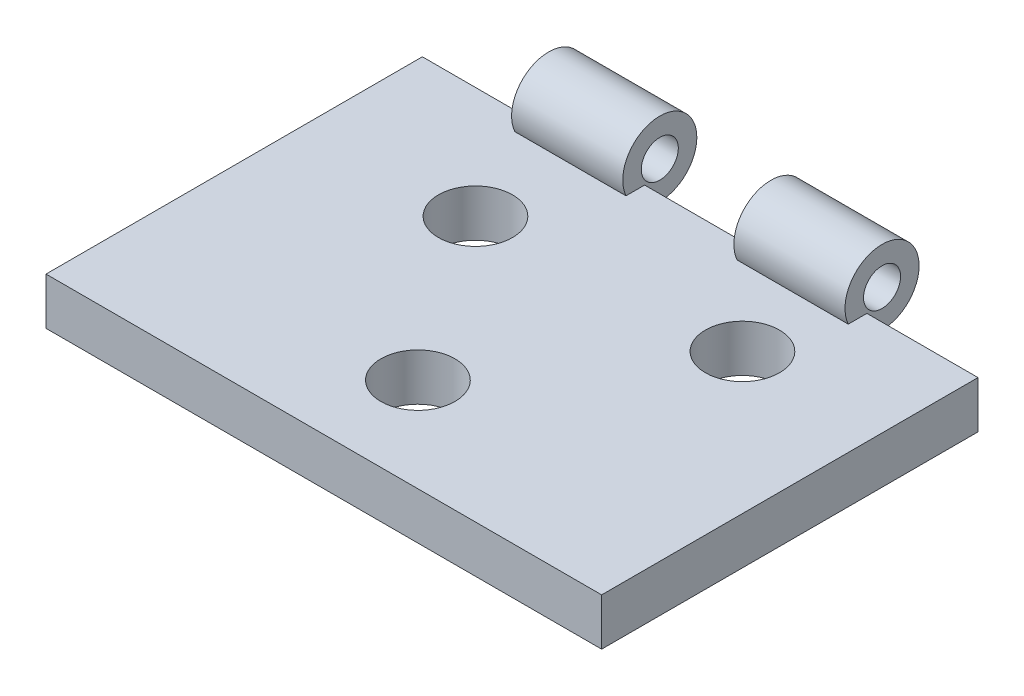
ISO-10303-21;
HEADER;
FILE_DESCRIPTION(('STEP AP214'),'2;1');
FILE_NAME('part.step','',(''),(''),'','','');
FILE_SCHEMA(('AUTOMOTIVE_DESIGN { 1 0 10303 214 1 1 1 1 }'));
ENDSEC;
DATA;
#1=APPLICATION_CONTEXT('core data for automotive mechanical design processes');
#2=APPLICATION_PROTOCOL_DEFINITION('international standard','automotive_design',2000,#1);
#3=PRODUCT_CONTEXT('',#1,'mechanical');
#4=PRODUCT('Part','Part','',(#3));
#5=PRODUCT_RELATED_PRODUCT_CATEGORY('part','',(#4));
#6=PRODUCT_DEFINITION_FORMATION('','',#4);
#7=PRODUCT_DEFINITION_CONTEXT('part definition',#1,'design');
#8=PRODUCT_DEFINITION('design','',#6,#7);
#9=PRODUCT_DEFINITION_SHAPE('','',#8);
#10=(LENGTH_UNIT() NAMED_UNIT(*) SI_UNIT(.MILLI.,.METRE.));
#11=(NAMED_UNIT(*) PLANE_ANGLE_UNIT() SI_UNIT($,.RADIAN.));
#12=(NAMED_UNIT(*) SI_UNIT($,.STERADIAN.) SOLID_ANGLE_UNIT());
#13=UNCERTAINTY_MEASURE_WITH_UNIT(LENGTH_MEASURE(1.E-05),#10,'distance_accuracy_value','');
#14=(GEOMETRIC_REPRESENTATION_CONTEXT(3) GLOBAL_UNCERTAINTY_ASSIGNED_CONTEXT((#13)) GLOBAL_UNIT_ASSIGNED_CONTEXT((#10,
#11,#12)) REPRESENTATION_CONTEXT('',''));
#15=CARTESIAN_POINT('',(0.,0.,0.));
#16=DIRECTION('',(0.,0.,1.));
#17=DIRECTION('',(1.,0.,0.));
#18=AXIS2_PLACEMENT_3D('',#15,#16,#17);
#19=CARTESIAN_POINT('',(0.,6.35,-25.4));
#20=DIRECTION('',(0.,0.,-1.));
#21=DIRECTION('',(-1.,0.,0.));
#22=AXIS2_PLACEMENT_3D('',#19,#20,#21);
#23=PLANE('',#22);
#24=DIRECTION('',(-1.,0.,0.));
#25=VECTOR('',#24,1.);
#26=CARTESIAN_POINT('',(22.5,3.83737281295908,-25.4));
#27=LINE('',#26,#25);
#28=CARTESIAN_POINT('',(22.5,3.83737281295908,-25.4));
#29=VERTEX_POINT('',#28);
#30=CARTESIAN_POINT('',(7.5,3.83737281295908,-25.4));
#31=VERTEX_POINT('',#30);
#32=EDGE_CURVE('E60',#29,#31,#27,.T.);
#33=ORIENTED_EDGE('',*,*,#32,.F.);
#34=DIRECTION('',(0.,1.,0.));
#35=VECTOR('',#34,1.);
#36=CARTESIAN_POINT('',(22.5,6.35,-25.4));
#37=LINE('',#36,#35);
#38=CARTESIAN_POINT('',(22.5,6.35,-25.4));
#39=VERTEX_POINT('',#38);
#40=EDGE_CURVE('E152',#29,#39,#37,.T.);
#41=ORIENTED_EDGE('',*,*,#40,.T.);
#42=DIRECTION('',(1.,0.,0.));
#43=VECTOR('',#42,1.);
#44=CARTESIAN_POINT('',(0.,6.35,-25.4));
#45=LINE('',#44,#43);
#46=CARTESIAN_POINT('',(37.5,6.35,-25.4));
#47=VERTEX_POINT('',#46);
#48=EDGE_CURVE('E189',#39,#47,#45,.T.);
#49=ORIENTED_EDGE('',*,*,#48,.T.);
#50=DIRECTION('',(0.,-1.,0.));
#51=VECTOR('',#50,1.);
#52=CARTESIAN_POINT('',(37.5,6.35,-25.4));
#53=LINE('',#52,#51);
#54=CARTESIAN_POINT('',(37.5,0.,-25.4));
#55=VERTEX_POINT('',#54);
#56=EDGE_CURVE('E235',#47,#55,#53,.T.);
#57=ORIENTED_EDGE('',*,*,#56,.T.);
#58=DIRECTION('',(1.,0.,0.));
#59=VECTOR('',#58,1.);
#60=CARTESIAN_POINT('',(0.,0.,-25.4));
#61=LINE('',#60,#59);
#62=CARTESIAN_POINT('',(-37.5,0.,-25.4));
#63=VERTEX_POINT('',#62);
#64=EDGE_CURVE('E218',#63,#55,#61,.T.);
#65=ORIENTED_EDGE('',*,*,#64,.F.);
#66=DIRECTION('',(0.,-1.,0.));
#67=VECTOR('',#66,1.);
#68=CARTESIAN_POINT('',(-37.5,6.35,-25.4));
#69=LINE('',#68,#67);
#70=CARTESIAN_POINT('',(-37.5,6.35,-25.4));
#71=VERTEX_POINT('',#70);
#72=EDGE_CURVE('E207',#71,#63,#69,.T.);
#73=ORIENTED_EDGE('',*,*,#72,.F.);
#74=CARTESIAN_POINT('',(-22.5,6.35,-25.4));
#75=VERTEX_POINT('',#74);
#76=EDGE_CURVE('E190',#71,#75,#45,.T.);
#77=ORIENTED_EDGE('',*,*,#76,.T.);
#78=DIRECTION('',(0.,1.,0.));
#79=VECTOR('',#78,1.);
#80=CARTESIAN_POINT('',(-22.5,6.35,-25.4));
#81=LINE('',#80,#79);
#82=CARTESIAN_POINT('',(-22.5,3.83737281295908,-25.4));
#83=VERTEX_POINT('',#82);
#84=EDGE_CURVE('E162',#83,#75,#81,.T.);
#85=ORIENTED_EDGE('',*,*,#84,.F.);
#86=DIRECTION('',(-1.,0.,0.));
#87=VECTOR('',#86,1.);
#88=CARTESIAN_POINT('',(-7.5,3.83737281295908,-25.4));
#89=LINE('',#88,#87);
#90=CARTESIAN_POINT('',(-7.5,3.83737281295908,-25.4));
#91=VERTEX_POINT('',#90);
#92=EDGE_CURVE('E172',#91,#83,#89,.T.);
#93=ORIENTED_EDGE('',*,*,#92,.F.);
#94=DIRECTION('',(0.,1.,0.));
#95=VECTOR('',#94,1.);
#96=CARTESIAN_POINT('',(-7.5,6.35,-25.4));
#97=LINE('',#96,#95);
#98=CARTESIAN_POINT('',(-7.5,6.35,-25.4));
#99=VERTEX_POINT('',#98);
#100=EDGE_CURVE('E169',#91,#99,#97,.T.);
#101=ORIENTED_EDGE('',*,*,#100,.T.);
#102=CARTESIAN_POINT('',(7.5,6.35,-25.4));
#103=VERTEX_POINT('',#102);
#104=EDGE_CURVE('E195',#99,#103,#45,.T.);
#105=ORIENTED_EDGE('',*,*,#104,.T.);
#106=DIRECTION('',(0.,1.,0.));
#107=VECTOR('',#106,1.);
#108=CARTESIAN_POINT('',(7.5,6.35,-25.4));
#109=LINE('',#108,#107);
#110=EDGE_CURVE('E65',#31,#103,#109,.T.);
#111=ORIENTED_EDGE('',*,*,#110,.F.);
#112=EDGE_LOOP('',(#33,#41,#49,#57,#65,#73,#77,#85,#93,#101,#105,#111));
#113=FACE_BOUND('',#112,.T.);
#114=ADVANCED_FACE('F43',(#113),#23,.T.);
#115=CARTESIAN_POINT('',(0.,6.35,0.));
#116=DIRECTION('',(0.,1.,0.));
#117=DIRECTION('',(0.,0.,1.));
#118=AXIS2_PLACEMENT_3D('',#115,#116,#117);
#119=PLANE('',#118);
#120=CARTESIAN_POINT('',(0.,6.35,12.7));
#121=DIRECTION('',(0.,1.,0.));
#122=DIRECTION('',(0.,0.,1.));
#123=AXIS2_PLACEMENT_3D('',#120,#121,#122);
#124=CIRCLE('',#123,5.);
#125=CARTESIAN_POINT('',(0.,6.35,17.7));
#126=VERTEX_POINT('',#125);
#127=EDGE_CURVE('E194',#126,#126,#124,.T.);
#128=ORIENTED_EDGE('',*,*,#127,.F.);
#129=EDGE_LOOP('',(#128));
#130=FACE_BOUND('',#129,.T.);
#131=CARTESIAN_POINT('',(18.5438369736078,6.35,-12.5603589101237));
#132=DIRECTION('',(0.,1.,0.));
#133=DIRECTION('',(0.,0.,1.));
#134=AXIS2_PLACEMENT_3D('',#131,#132,#133);
#135=CIRCLE('',#134,5.);
#136=CARTESIAN_POINT('',(18.5438369736078,6.35,-7.56035891012367));
#137=VERTEX_POINT('',#136);
#138=EDGE_CURVE('E199',#137,#137,#135,.T.);
#139=ORIENTED_EDGE('',*,*,#138,.F.);
#140=EDGE_LOOP('',(#139));
#141=FACE_BOUND('',#140,.T.);
#142=CARTESIAN_POINT('',(-15.2791730334857,6.35,-10.3490932013476));
#143=DIRECTION('',(0.,1.,0.));
#144=DIRECTION('',(0.,0.,1.));
#145=AXIS2_PLACEMENT_3D('',#142,#143,#144);
#146=CIRCLE('',#145,5.);
#147=CARTESIAN_POINT('',(-15.2791730334857,6.35,-5.34909320134763));
#148=VERTEX_POINT('',#147);
#149=EDGE_CURVE('E203',#148,#148,#146,.T.);
#150=ORIENTED_EDGE('',*,*,#149,.F.);
#151=EDGE_LOOP('',(#150));
#152=FACE_BOUND('',#151,.T.);
#153=ORIENTED_EDGE('',*,*,#48,.F.);
#154=DIRECTION('',(0.,0.,1.));
#155=VECTOR('',#154,1.);
#156=CARTESIAN_POINT('',(22.5,6.35,0.));
#157=LINE('',#156,#155);
#158=CARTESIAN_POINT('',(22.5,6.35,-22.8873728129591));
#159=VERTEX_POINT('',#158);
#160=EDGE_CURVE('E11',#39,#159,#157,.T.);
#161=ORIENTED_EDGE('',*,*,#160,.T.);
#162=DIRECTION('',(-1.,0.,0.));
#163=VECTOR('',#162,1.);
#164=CARTESIAN_POINT('',(22.5,6.35,-22.8873728129591));
#165=LINE('',#164,#163);
#166=CARTESIAN_POINT('',(7.5,6.35,-22.8873728129591));
#167=VERTEX_POINT('',#166);
#168=EDGE_CURVE('E53',#167,#159,#165,.F.);
#169=ORIENTED_EDGE('',*,*,#168,.F.);
#170=DIRECTION('',(0.,0.,1.));
#171=VECTOR('',#170,1.);
#172=CARTESIAN_POINT('',(7.5,6.35,0.));
#173=LINE('',#172,#171);
#174=EDGE_CURVE('E123',#103,#167,#173,.T.);
#175=ORIENTED_EDGE('',*,*,#174,.F.);
#176=ORIENTED_EDGE('',*,*,#104,.F.);
#177=DIRECTION('',(0.,0.,1.));
#178=VECTOR('',#177,1.);
#179=CARTESIAN_POINT('',(-7.5,6.35,0.));
#180=LINE('',#179,#178);
#181=CARTESIAN_POINT('',(-7.5,6.35,-22.8873728129591));
#182=VERTEX_POINT('',#181);
#183=EDGE_CURVE('E136',#99,#182,#180,.T.);
#184=ORIENTED_EDGE('',*,*,#183,.T.);
#185=DIRECTION('',(-1.,0.,0.));
#186=VECTOR('',#185,1.);
#187=CARTESIAN_POINT('',(-7.5,6.35,-22.8873728129591));
#188=LINE('',#187,#186);
#189=CARTESIAN_POINT('',(-22.5,6.35,-22.8873728129591));
#190=VERTEX_POINT('',#189);
#191=EDGE_CURVE('E249',#190,#182,#188,.F.);
#192=ORIENTED_EDGE('',*,*,#191,.F.);
#193=DIRECTION('',(0.,0.,1.));
#194=VECTOR('',#193,1.);
#195=CARTESIAN_POINT('',(-22.5,6.35,0.));
#196=LINE('',#195,#194);
#197=EDGE_CURVE('E245',#75,#190,#196,.T.);
#198=ORIENTED_EDGE('',*,*,#197,.F.);
#199=ORIENTED_EDGE('',*,*,#76,.F.);
#200=DIRECTION('',(0.,0.,-1.));
#201=VECTOR('',#200,1.);
#202=CARTESIAN_POINT('',(-37.5,6.35,0.));
#203=LINE('',#202,#201);
#204=CARTESIAN_POINT('',(-37.5,6.35,25.4));
#205=VERTEX_POINT('',#204);
#206=EDGE_CURVE('E177',#205,#71,#203,.T.);
#207=ORIENTED_EDGE('',*,*,#206,.F.);
#208=DIRECTION('',(1.,0.,0.));
#209=VECTOR('',#208,1.);
#210=CARTESIAN_POINT('',(0.,6.35,25.4));
#211=LINE('',#210,#209);
#212=CARTESIAN_POINT('',(37.5,6.35,25.4));
#213=VERTEX_POINT('',#212);
#214=EDGE_CURVE('E181',#205,#213,#211,.T.);
#215=ORIENTED_EDGE('',*,*,#214,.T.);
#216=DIRECTION('',(0.,0.,-1.));
#217=VECTOR('',#216,1.);
#218=CARTESIAN_POINT('',(37.5,6.35,0.));
#219=LINE('',#218,#217);
#220=EDGE_CURVE('E185',#213,#47,#219,.T.);
#221=ORIENTED_EDGE('',*,*,#220,.T.);
#222=EDGE_LOOP('',(#153,#161,#169,#175,#176,#184,#192,#198,#199,#207,#215,#221));
#223=FACE_BOUND('',#222,.T.);
#224=ADVANCED_FACE('F121',(#130,#141,#152,#223),#119,.T.);
#225=CARTESIAN_POINT('',(-37.5,6.35,0.));
#226=DIRECTION('',(-1.,0.,0.));
#227=DIRECTION('',(0.,0.,1.));
#228=AXIS2_PLACEMENT_3D('',#225,#226,#227);
#229=PLANE('',#228);
#230=DIRECTION('',(0.,0.,-1.));
#231=VECTOR('',#230,1.);
#232=CARTESIAN_POINT('',(-37.5,0.,0.));
#233=LINE('',#232,#231);
#234=CARTESIAN_POINT('',(-37.5,0.,25.4));
#235=VERTEX_POINT('',#234);
#236=EDGE_CURVE('E176',#235,#63,#233,.T.);
#237=ORIENTED_EDGE('',*,*,#236,.F.);
#238=DIRECTION('',(0.,-1.,0.));
#239=VECTOR('',#238,1.);
#240=CARTESIAN_POINT('',(-37.5,6.35,25.4));
#241=LINE('',#240,#239);
#242=EDGE_CURVE('E242',#205,#235,#241,.T.);
#243=ORIENTED_EDGE('',*,*,#242,.F.);
#244=ORIENTED_EDGE('',*,*,#206,.T.);
#245=ORIENTED_EDGE('',*,*,#72,.T.);
#246=EDGE_LOOP('',(#237,#243,#244,#245));
#247=FACE_BOUND('',#246,.T.);
#248=ADVANCED_FACE('F45',(#247),#229,.T.);
#249=CARTESIAN_POINT('',(0.,6.35,25.4));
#250=DIRECTION('',(0.,0.,-1.));
#251=DIRECTION('',(-1.,0.,0.));
#252=AXIS2_PLACEMENT_3D('',#249,#250,#251);
#253=PLANE('',#252);
#254=DIRECTION('',(1.,0.,0.));
#255=VECTOR('',#254,1.);
#256=CARTESIAN_POINT('',(0.,0.,25.4));
#257=LINE('',#256,#255);
#258=CARTESIAN_POINT('',(37.5,0.,25.4));
#259=VERTEX_POINT('',#258);
#260=EDGE_CURVE('E211',#235,#259,#257,.T.);
#261=ORIENTED_EDGE('',*,*,#260,.T.);
#262=DIRECTION('',(0.,-1.,0.));
#263=VECTOR('',#262,1.);
#264=CARTESIAN_POINT('',(37.5,6.35,25.4));
#265=LINE('',#264,#263);
#266=EDGE_CURVE('E238',#213,#259,#265,.T.);
#267=ORIENTED_EDGE('',*,*,#266,.F.);
#268=ORIENTED_EDGE('',*,*,#214,.F.);
#269=ORIENTED_EDGE('',*,*,#242,.T.);
#270=EDGE_LOOP('',(#261,#267,#268,#269));
#271=FACE_BOUND('',#270,.T.);
#272=ADVANCED_FACE('F274',(#271),#253,.F.);
#273=CARTESIAN_POINT('',(37.5,6.35,0.));
#274=DIRECTION('',(-1.,0.,0.));
#275=DIRECTION('',(0.,0.,1.));
#276=AXIS2_PLACEMENT_3D('',#273,#274,#275);
#277=PLANE('',#276);
#278=DIRECTION('',(0.,0.,-1.));
#279=VECTOR('',#278,1.);
#280=CARTESIAN_POINT('',(37.5,0.,0.));
#281=LINE('',#280,#279);
#282=EDGE_CURVE('E214',#259,#55,#281,.T.);
#283=ORIENTED_EDGE('',*,*,#282,.T.);
#284=ORIENTED_EDGE('',*,*,#56,.F.);
#285=ORIENTED_EDGE('',*,*,#220,.F.);
#286=ORIENTED_EDGE('',*,*,#266,.T.);
#287=EDGE_LOOP('',(#283,#284,#285,#286));
#288=FACE_BOUND('',#287,.T.);
#289=ADVANCED_FACE('F278',(#288),#277,.F.);
#290=CARTESIAN_POINT('',(18.5438369736078,6.35,-12.5603589101237));
#291=DIRECTION('',(0.,-1.,0.));
#292=DIRECTION('',(0.,0.,-1.));
#293=AXIS2_PLACEMENT_3D('',#290,#291,#292);
#294=CYLINDRICAL_SURFACE('',#293,5.);
#295=ORIENTED_EDGE('',*,*,#138,.T.);
#296=EDGE_LOOP('',(#295));
#297=FACE_BOUND('',#296,.T.);
#298=CARTESIAN_POINT('',(18.5438369736078,0.,-12.5603589101237));
#299=DIRECTION('',(0.,1.,0.));
#300=DIRECTION('',(0.,0.,1.));
#301=AXIS2_PLACEMENT_3D('',#298,#299,#300);
#302=CIRCLE('',#301,5.);
#303=CARTESIAN_POINT('',(18.5438369736078,0.,-7.56035891012367));
#304=VERTEX_POINT('',#303);
#305=EDGE_CURVE('E226',#304,#304,#302,.T.);
#306=ORIENTED_EDGE('',*,*,#305,.F.);
#307=EDGE_LOOP('',(#306));
#308=FACE_BOUND('',#307,.T.);
#309=ADVANCED_FACE('F308',(#297,#308),#294,.F.);
#310=CARTESIAN_POINT('',(0.,6.35,12.7));
#311=DIRECTION('',(0.,-1.,0.));
#312=DIRECTION('',(0.,0.,-1.));
#313=AXIS2_PLACEMENT_3D('',#310,#311,#312);
#314=CYLINDRICAL_SURFACE('',#313,5.);
#315=ORIENTED_EDGE('',*,*,#127,.T.);
#316=EDGE_LOOP('',(#315));
#317=FACE_BOUND('',#316,.T.);
#318=CARTESIAN_POINT('',(0.,0.,12.7));
#319=DIRECTION('',(0.,1.,0.));
#320=DIRECTION('',(0.,0.,1.));
#321=AXIS2_PLACEMENT_3D('',#318,#319,#320);
#322=CIRCLE('',#321,5.);
#323=CARTESIAN_POINT('',(0.,0.,17.7));
#324=VERTEX_POINT('',#323);
#325=EDGE_CURVE('E222',#324,#324,#322,.T.);
#326=ORIENTED_EDGE('',*,*,#325,.F.);
#327=EDGE_LOOP('',(#326));
#328=FACE_BOUND('',#327,.T.);
#329=ADVANCED_FACE('F305',(#317,#328),#314,.F.);
#330=CARTESIAN_POINT('',(-15.2791730334857,6.35,-10.3490932013476));
#331=DIRECTION('',(0.,-1.,0.));
#332=DIRECTION('',(0.,0.,-1.));
#333=AXIS2_PLACEMENT_3D('',#330,#331,#332);
#334=CYLINDRICAL_SURFACE('',#333,5.);
#335=ORIENTED_EDGE('',*,*,#149,.T.);
#336=EDGE_LOOP('',(#335));
#337=FACE_BOUND('',#336,.T.);
#338=CARTESIAN_POINT('',(-15.2791730334857,0.,-10.3490932013476));
#339=DIRECTION('',(0.,1.,0.));
#340=DIRECTION('',(0.,0.,1.));
#341=AXIS2_PLACEMENT_3D('',#338,#339,#340);
#342=CIRCLE('',#341,5.);
#343=CARTESIAN_POINT('',(-15.2791730334857,0.,-5.34909320134763));
#344=VERTEX_POINT('',#343);
#345=EDGE_CURVE('E182',#344,#344,#342,.T.);
#346=ORIENTED_EDGE('',*,*,#345,.F.);
#347=EDGE_LOOP('',(#346));
#348=FACE_BOUND('',#347,.T.);
#349=ADVANCED_FACE('F404',(#337,#348),#334,.F.);
#350=CARTESIAN_POINT('',(0.,0.,0.));
#351=DIRECTION('',(0.,1.,0.));
#352=DIRECTION('',(0.,0.,1.));
#353=AXIS2_PLACEMENT_3D('',#350,#351,#352);
#354=PLANE('',#353);
#355=ORIENTED_EDGE('',*,*,#236,.T.);
#356=ORIENTED_EDGE('',*,*,#64,.T.);
#357=ORIENTED_EDGE('',*,*,#282,.F.);
#358=ORIENTED_EDGE('',*,*,#260,.F.);
#359=EDGE_LOOP('',(#355,#356,#357,#358));
#360=FACE_BOUND('',#359,.T.);
#361=ORIENTED_EDGE('',*,*,#325,.T.);
#362=EDGE_LOOP('',(#361));
#363=FACE_BOUND('',#362,.T.);
#364=ORIENTED_EDGE('',*,*,#305,.T.);
#365=EDGE_LOOP('',(#364));
#366=FACE_BOUND('',#365,.T.);
#367=ORIENTED_EDGE('',*,*,#345,.T.);
#368=EDGE_LOOP('',(#367));
#369=FACE_BOUND('',#368,.T.);
#370=ADVANCED_FACE('F400',(#360,#363,#366,#369),#354,.F.);
#371=CARTESIAN_POINT('',(-7.5,8.39848233886866,-27.4484823388687));
#372=DIRECTION('',(-1.,0.,0.));
#373=DIRECTION('',(0.,0.,1.));
#374=AXIS2_PLACEMENT_3D('',#371,#372,#373);
#375=CYLINDRICAL_SURFACE('',#374,5.);
#376=CARTESIAN_POINT('',(-7.5,8.39848233886866,-27.4484823388687));
#377=DIRECTION('',(-1.,0.,0.));
#378=DIRECTION('',(0.,0.,1.));
#379=AXIS2_PLACEMENT_3D('',#376,#377,#378);
#380=CIRCLE('',#379,5.);
#381=EDGE_CURVE('E158',#182,#91,#380,.T.);
#382=ORIENTED_EDGE('',*,*,#381,.T.);
#383=ORIENTED_EDGE('',*,*,#92,.T.);
#384=CARTESIAN_POINT('',(-22.5,8.39848233886866,-27.4484823388687));
#385=DIRECTION('',(-1.,0.,0.));
#386=DIRECTION('',(0.,0.,1.));
#387=AXIS2_PLACEMENT_3D('',#384,#385,#386);
#388=CIRCLE('',#387,5.);
#389=EDGE_CURVE('E157',#190,#83,#388,.T.);
#390=ORIENTED_EDGE('',*,*,#389,.F.);
#391=ORIENTED_EDGE('',*,*,#191,.T.);
#392=EDGE_LOOP('',(#382,#383,#390,#391));
#393=FACE_BOUND('',#392,.T.);
#394=ADVANCED_FACE('F260',(#393),#375,.T.);
#395=CARTESIAN_POINT('',(-7.5,8.39848233886866,-27.4484823388687));
#396=DIRECTION('',(-1.,0.,0.));
#397=DIRECTION('',(0.,0.,1.));
#398=AXIS2_PLACEMENT_3D('',#395,#396,#397);
#399=PLANE('',#398);
#400=CARTESIAN_POINT('',(-7.5,8.39848233886866,-27.4484823388687));
#401=DIRECTION('',(-1.,0.,0.));
#402=DIRECTION('',(0.,0.,1.));
#403=AXIS2_PLACEMENT_3D('',#400,#401,#402);
#404=CIRCLE('',#403,2.5);
#405=CARTESIAN_POINT('',(-7.5,8.39848233886866,-24.9484823388687));
#406=VERTEX_POINT('',#405);
#407=EDGE_CURVE('E141',#406,#406,#404,.T.);
#408=ORIENTED_EDGE('',*,*,#407,.T.);
#409=EDGE_LOOP('',(#408));
#410=FACE_BOUND('',#409,.T.);
#411=ORIENTED_EDGE('',*,*,#100,.F.);
#412=ORIENTED_EDGE('',*,*,#381,.F.);
#413=ORIENTED_EDGE('',*,*,#183,.F.);
#414=EDGE_LOOP('',(#411,#412,#413));
#415=FACE_BOUND('',#414,.T.);
#416=ADVANCED_FACE('F261',(#410,#415),#399,.F.);
#417=CARTESIAN_POINT('',(-22.5,8.39848233886866,-27.4484823388687));
#418=DIRECTION('',(-1.,0.,0.));
#419=DIRECTION('',(0.,0.,1.));
#420=AXIS2_PLACEMENT_3D('',#417,#418,#419);
#421=PLANE('',#420);
#422=CARTESIAN_POINT('',(-22.5,8.39848233886866,-27.4484823388687));
#423=DIRECTION('',(-1.,0.,0.));
#424=DIRECTION('',(0.,0.,1.));
#425=AXIS2_PLACEMENT_3D('',#422,#423,#424);
#426=CIRCLE('',#425,2.5);
#427=CARTESIAN_POINT('',(-22.5,8.39848233886866,-24.9484823388687));
#428=VERTEX_POINT('',#427);
#429=EDGE_CURVE('E147',#428,#428,#426,.T.);
#430=ORIENTED_EDGE('',*,*,#429,.F.);
#431=EDGE_LOOP('',(#430));
#432=FACE_BOUND('',#431,.T.);
#433=ORIENTED_EDGE('',*,*,#389,.T.);
#434=ORIENTED_EDGE('',*,*,#84,.T.);
#435=ORIENTED_EDGE('',*,*,#197,.T.);
#436=EDGE_LOOP('',(#433,#434,#435));
#437=FACE_BOUND('',#436,.T.);
#438=ADVANCED_FACE('F263',(#432,#437),#421,.T.);
#439=CARTESIAN_POINT('',(22.5,8.39848233886866,-27.4484823388687));
#440=DIRECTION('',(-1.,0.,0.));
#441=DIRECTION('',(0.,0.,1.));
#442=AXIS2_PLACEMENT_3D('',#439,#440,#441);
#443=CYLINDRICAL_SURFACE('',#442,5.);
#444=CARTESIAN_POINT('',(22.5,8.39848233886866,-27.4484823388687));
#445=DIRECTION('',(-1.,0.,0.));
#446=DIRECTION('',(0.,0.,1.));
#447=AXIS2_PLACEMENT_3D('',#444,#445,#446);
#448=CIRCLE('',#447,5.);
#449=EDGE_CURVE('E140',#159,#29,#448,.T.);
#450=ORIENTED_EDGE('',*,*,#449,.T.);
#451=ORIENTED_EDGE('',*,*,#32,.T.);
#452=CARTESIAN_POINT('',(7.5,8.39848233886866,-27.4484823388687));
#453=DIRECTION('',(-1.,0.,0.));
#454=DIRECTION('',(0.,0.,1.));
#455=AXIS2_PLACEMENT_3D('',#452,#453,#454);
#456=CIRCLE('',#455,5.);
#457=EDGE_CURVE('E134',#167,#31,#456,.T.);
#458=ORIENTED_EDGE('',*,*,#457,.F.);
#459=ORIENTED_EDGE('',*,*,#168,.T.);
#460=EDGE_LOOP('',(#450,#451,#458,#459));
#461=FACE_BOUND('',#460,.T.);
#462=ADVANCED_FACE('F138',(#461),#443,.T.);
#463=CARTESIAN_POINT('',(22.5,8.39848233886866,-27.4484823388687));
#464=DIRECTION('',(-1.,0.,0.));
#465=DIRECTION('',(0.,0.,1.));
#466=AXIS2_PLACEMENT_3D('',#463,#464,#465);
#467=PLANE('',#466);
#468=CARTESIAN_POINT('',(22.5,8.39848233886866,-27.4484823388687));
#469=DIRECTION('',(-1.,0.,0.));
#470=DIRECTION('',(0.,0.,1.));
#471=AXIS2_PLACEMENT_3D('',#468,#469,#470);
#472=CIRCLE('',#471,2.5);
#473=CARTESIAN_POINT('',(22.5,8.39848233886866,-24.9484823388687));
#474=VERTEX_POINT('',#473);
#475=EDGE_CURVE('E386',#474,#474,#472,.T.);
#476=ORIENTED_EDGE('',*,*,#475,.T.);
#477=EDGE_LOOP('',(#476));
#478=FACE_BOUND('',#477,.T.);
#479=ORIENTED_EDGE('',*,*,#40,.F.);
#480=ORIENTED_EDGE('',*,*,#449,.F.);
#481=ORIENTED_EDGE('',*,*,#160,.F.);
#482=EDGE_LOOP('',(#479,#480,#481));
#483=FACE_BOUND('',#482,.T.);
#484=ADVANCED_FACE('F282',(#478,#483),#467,.F.);
#485=CARTESIAN_POINT('',(7.5,8.39848233886866,-27.4484823388687));
#486=DIRECTION('',(-1.,0.,0.));
#487=DIRECTION('',(0.,0.,1.));
#488=AXIS2_PLACEMENT_3D('',#485,#486,#487);
#489=PLANE('',#488);
#490=CARTESIAN_POINT('',(7.5,8.39848233886866,-27.4484823388687));
#491=DIRECTION('',(-1.,0.,0.));
#492=DIRECTION('',(0.,0.,1.));
#493=AXIS2_PLACEMENT_3D('',#490,#491,#492);
#494=CIRCLE('',#493,2.5);
#495=CARTESIAN_POINT('',(7.5,8.39848233886866,-24.9484823388687));
#496=VERTEX_POINT('',#495);
#497=EDGE_CURVE('E47',#496,#496,#494,.T.);
#498=ORIENTED_EDGE('',*,*,#497,.F.);
#499=EDGE_LOOP('',(#498));
#500=FACE_BOUND('',#499,.T.);
#501=ORIENTED_EDGE('',*,*,#457,.T.);
#502=ORIENTED_EDGE('',*,*,#110,.T.);
#503=ORIENTED_EDGE('',*,*,#174,.T.);
#504=EDGE_LOOP('',(#501,#502,#503));
#505=FACE_BOUND('',#504,.T.);
#506=ADVANCED_FACE('F133',(#500,#505),#489,.T.);
#507=CARTESIAN_POINT('',(37.5,8.39848233886866,-27.4484823388687));
#508=DIRECTION('',(-1.,0.,0.));
#509=DIRECTION('',(0.,0.,1.));
#510=AXIS2_PLACEMENT_3D('',#507,#508,#509);
#511=CYLINDRICAL_SURFACE('',#510,2.5);
#512=ORIENTED_EDGE('',*,*,#497,.T.);
#513=EDGE_LOOP('',(#512));
#514=FACE_BOUND('',#513,.T.);
#515=ORIENTED_EDGE('',*,*,#475,.F.);
#516=EDGE_LOOP('',(#515));
#517=FACE_BOUND('',#516,.T.);
#518=ADVANCED_FACE('F290',(#514,#517),#511,.F.);
#519=ORIENTED_EDGE('',*,*,#429,.T.);
#520=EDGE_LOOP('',(#519));
#521=FACE_BOUND('',#520,.T.);
#522=ORIENTED_EDGE('',*,*,#407,.F.);
#523=EDGE_LOOP('',(#522));
#524=FACE_BOUND('',#523,.T.);
#525=ADVANCED_FACE('F369',(#521,#524),#511,.F.);
#526=CLOSED_SHELL('',(#114,#224,#248,#272,#289,#309,#329,#349,#370,#394,#416,#438,#462,#484,
#506,#518,#525));
#527=MANIFOLD_SOLID_BREP('B2',#526);
#528=ADVANCED_BREP_SHAPE_REPRESENTATION('',(#18,#527),#14);
#529=SHAPE_DEFINITION_REPRESENTATION(#9,#528);
ENDSEC;
END-ISO-10303-21;
